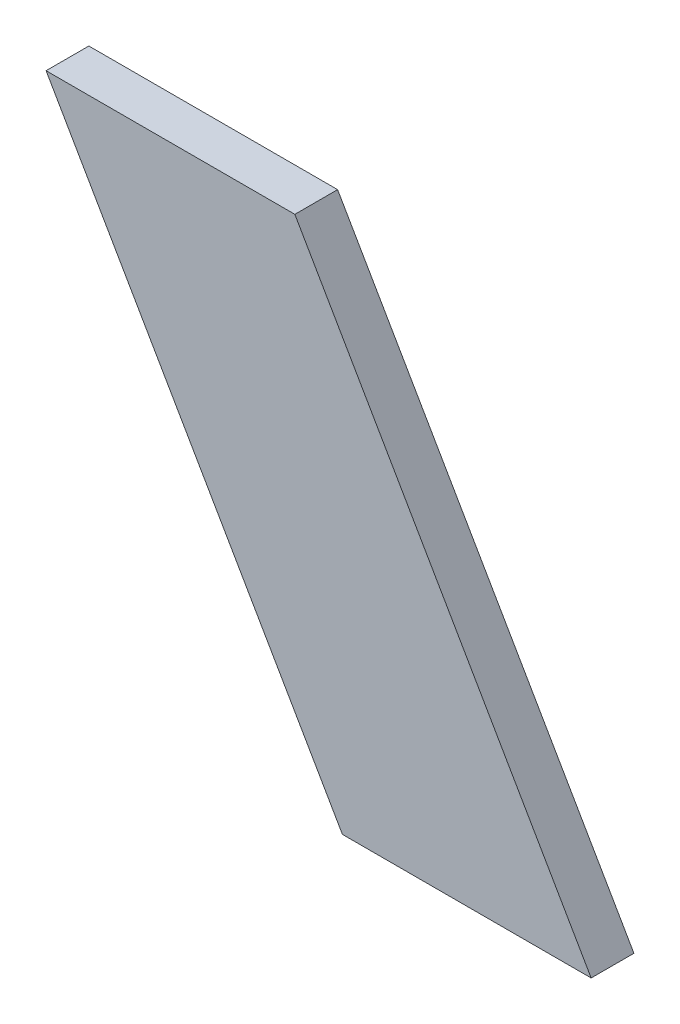
ISO-10303-21;
HEADER;
FILE_DESCRIPTION(('STEP AP214'),'2;1');
FILE_NAME('part.step','',(''),(''),'','','');
FILE_SCHEMA(('AUTOMOTIVE_DESIGN { 1 0 10303 214 1 1 1 1 }'));
ENDSEC;
DATA;
#1=APPLICATION_CONTEXT('core data for automotive mechanical design processes');
#2=APPLICATION_PROTOCOL_DEFINITION('international standard','automotive_design',2000,#1);
#3=PRODUCT_CONTEXT('',#1,'mechanical');
#4=PRODUCT('Part','Part','',(#3));
#5=PRODUCT_RELATED_PRODUCT_CATEGORY('part','',(#4));
#6=PRODUCT_DEFINITION_FORMATION('','',#4);
#7=PRODUCT_DEFINITION_CONTEXT('part definition',#1,'design');
#8=PRODUCT_DEFINITION('design','',#6,#7);
#9=PRODUCT_DEFINITION_SHAPE('','',#8);
#10=(LENGTH_UNIT() NAMED_UNIT(*) SI_UNIT(.MILLI.,.METRE.));
#11=(NAMED_UNIT(*) PLANE_ANGLE_UNIT() SI_UNIT($,.RADIAN.));
#12=(NAMED_UNIT(*) SI_UNIT($,.STERADIAN.) SOLID_ANGLE_UNIT());
#13=UNCERTAINTY_MEASURE_WITH_UNIT(LENGTH_MEASURE(1.E-05),#10,'distance_accuracy_value','');
#14=(GEOMETRIC_REPRESENTATION_CONTEXT(3) GLOBAL_UNCERTAINTY_ASSIGNED_CONTEXT((#13)) GLOBAL_UNIT_ASSIGNED_CONTEXT((#10,
#11,#12)) REPRESENTATION_CONTEXT('',''));
#15=CARTESIAN_POINT('',(0.,0.,0.));
#16=DIRECTION('',(0.,0.,1.));
#17=DIRECTION('',(1.,0.,0.));
#18=AXIS2_PLACEMENT_3D('',#15,#16,#17);
#19=CARTESIAN_POINT('',(64.4692193816531,-72.,-3.));
#20=DIRECTION('',(-0.866025403784439,-0.5,0.));
#21=DIRECTION('',(0.5,-0.866025403784439,0.));
#22=AXIS2_PLACEMENT_3D('',#19,#20,#21);
#23=PLANE('',#22);
#24=DIRECTION('',(0.,0.,1.));
#25=VECTOR('',#24,1.);
#26=CARTESIAN_POINT('',(64.4692193816531,-72.,-3.));
#27=LINE('',#26,#25);
#28=CARTESIAN_POINT('',(64.4692193816531,-72.,-3.));
#29=VERTEX_POINT('',#28);
#30=CARTESIAN_POINT('',(64.4692193816531,-72.,3.));
#31=VERTEX_POINT('',#30);
#32=EDGE_CURVE('E45',#29,#31,#27,.T.);
#33=ORIENTED_EDGE('',*,*,#32,.T.);
#34=DIRECTION('',(0.5,-0.866025403784439,0.));
#35=VECTOR('',#34,1.);
#36=CARTESIAN_POINT('',(64.4692193816531,-72.,3.));
#37=LINE('',#36,#35);
#38=CARTESIAN_POINT('',(22.9,0.,3.));
#39=VERTEX_POINT('',#38);
#40=EDGE_CURVE('E80',#39,#31,#37,.T.);
#41=ORIENTED_EDGE('',*,*,#40,.F.);
#42=DIRECTION('',(0.,0.,1.));
#43=VECTOR('',#42,1.);
#44=CARTESIAN_POINT('',(22.9,0.,-3.));
#45=LINE('',#44,#43);
#46=CARTESIAN_POINT('',(22.9,0.,-3.));
#47=VERTEX_POINT('',#46);
#48=EDGE_CURVE('E11',#47,#39,#45,.T.);
#49=ORIENTED_EDGE('',*,*,#48,.F.);
#50=DIRECTION('',(0.5,-0.866025403784439,0.));
#51=VECTOR('',#50,1.);
#52=CARTESIAN_POINT('',(64.4692193816531,-72.,-3.));
#53=LINE('',#52,#51);
#54=EDGE_CURVE('E79',#47,#29,#53,.T.);
#55=ORIENTED_EDGE('',*,*,#54,.T.);
#56=EDGE_LOOP('',(#33,#41,#49,#55));
#57=FACE_BOUND('',#56,.T.);
#58=ADVANCED_FACE('F39',(#57),#23,.T.);
#59=CARTESIAN_POINT('',(22.9,0.,-3.));
#60=DIRECTION('',(0.,1.,0.));
#61=DIRECTION('',(0.,0.,1.));
#62=AXIS2_PLACEMENT_3D('',#59,#60,#61);
#63=PLANE('',#62);
#64=ORIENTED_EDGE('',*,*,#48,.T.);
#65=DIRECTION('',(-1.,0.,0.));
#66=VECTOR('',#65,1.);
#67=CARTESIAN_POINT('',(22.9,0.,3.));
#68=LINE('',#67,#66);
#69=CARTESIAN_POINT('',(57.8,0.,3.));
#70=VERTEX_POINT('',#69);
#71=EDGE_CURVE('E96',#70,#39,#68,.T.);
#72=ORIENTED_EDGE('',*,*,#71,.F.);
#73=DIRECTION('',(0.,0.,1.));
#74=VECTOR('',#73,1.);
#75=CARTESIAN_POINT('',(57.8,0.,-3.));
#76=LINE('',#75,#74);
#77=CARTESIAN_POINT('',(57.8,0.,-3.));
#78=VERTEX_POINT('',#77);
#79=EDGE_CURVE('E50',#78,#70,#76,.T.);
#80=ORIENTED_EDGE('',*,*,#79,.F.);
#81=DIRECTION('',(-1.,0.,0.));
#82=VECTOR('',#81,1.);
#83=CARTESIAN_POINT('',(22.9,0.,-3.));
#84=LINE('',#83,#82);
#85=EDGE_CURVE('E82',#78,#47,#84,.T.);
#86=ORIENTED_EDGE('',*,*,#85,.T.);
#87=EDGE_LOOP('',(#64,#72,#80,#86));
#88=FACE_BOUND('',#87,.T.);
#89=ADVANCED_FACE('F112',(#88),#63,.T.);
#90=CARTESIAN_POINT('',(57.8,0.,-3.));
#91=DIRECTION('',(0.866025403784439,0.5,0.));
#92=DIRECTION('',(-0.5,0.866025403784439,0.));
#93=AXIS2_PLACEMENT_3D('',#90,#91,#92);
#94=PLANE('',#93);
#95=ORIENTED_EDGE('',*,*,#79,.T.);
#96=DIRECTION('',(-0.5,0.866025403784439,0.));
#97=VECTOR('',#96,1.);
#98=CARTESIAN_POINT('',(57.8,0.,3.));
#99=LINE('',#98,#97);
#100=CARTESIAN_POINT('',(99.3692193816531,-72.,3.));
#101=VERTEX_POINT('',#100);
#102=EDGE_CURVE('E95',#101,#70,#99,.T.);
#103=ORIENTED_EDGE('',*,*,#102,.F.);
#104=DIRECTION('',(0.,0.,1.));
#105=VECTOR('',#104,1.);
#106=CARTESIAN_POINT('',(99.3692193816531,-72.,-3.));
#107=LINE('',#106,#105);
#108=CARTESIAN_POINT('',(99.3692193816531,-72.,-3.));
#109=VERTEX_POINT('',#108);
#110=EDGE_CURVE('E84',#109,#101,#107,.T.);
#111=ORIENTED_EDGE('',*,*,#110,.F.);
#112=DIRECTION('',(-0.5,0.866025403784439,0.));
#113=VECTOR('',#112,1.);
#114=CARTESIAN_POINT('',(57.8,0.,-3.));
#115=LINE('',#114,#113);
#116=EDGE_CURVE('E101',#109,#78,#115,.T.);
#117=ORIENTED_EDGE('',*,*,#116,.T.);
#118=EDGE_LOOP('',(#95,#103,#111,#117));
#119=FACE_BOUND('',#118,.T.);
#120=ADVANCED_FACE('F110',(#119),#94,.T.);
#121=CARTESIAN_POINT('',(99.3692193816531,-72.,-3.));
#122=DIRECTION('',(0.,-1.,0.));
#123=DIRECTION('',(0.,0.,-1.));
#124=AXIS2_PLACEMENT_3D('',#121,#122,#123);
#125=PLANE('',#124);
#126=ORIENTED_EDGE('',*,*,#110,.T.);
#127=DIRECTION('',(1.,0.,0.));
#128=VECTOR('',#127,1.);
#129=CARTESIAN_POINT('',(99.3692193816531,-72.,3.));
#130=LINE('',#129,#128);
#131=EDGE_CURVE('E90',#31,#101,#130,.T.);
#132=ORIENTED_EDGE('',*,*,#131,.F.);
#133=ORIENTED_EDGE('',*,*,#32,.F.);
#134=DIRECTION('',(1.,0.,0.));
#135=VECTOR('',#134,1.);
#136=CARTESIAN_POINT('',(99.3692193816531,-72.,-3.));
#137=LINE('',#136,#135);
#138=EDGE_CURVE('E105',#29,#109,#137,.T.);
#139=ORIENTED_EDGE('',*,*,#138,.T.);
#140=EDGE_LOOP('',(#126,#132,#133,#139));
#141=FACE_BOUND('',#140,.T.);
#142=ADVANCED_FACE('F88',(#141),#125,.T.);
#143=CARTESIAN_POINT('',(0.,0.,-3.));
#144=DIRECTION('',(0.,0.,-1.));
#145=DIRECTION('',(-1.,0.,0.));
#146=AXIS2_PLACEMENT_3D('',#143,#144,#145);
#147=PLANE('',#146);
#148=ORIENTED_EDGE('',*,*,#54,.F.);
#149=ORIENTED_EDGE('',*,*,#85,.F.);
#150=ORIENTED_EDGE('',*,*,#116,.F.);
#151=ORIENTED_EDGE('',*,*,#138,.F.);
#152=EDGE_LOOP('',(#148,#149,#150,#151));
#153=FACE_BOUND('',#152,.T.);
#154=ADVANCED_FACE('F111',(#153),#147,.T.);
#155=CARTESIAN_POINT('',(0.,0.,3.));
#156=DIRECTION('',(0.,0.,-1.));
#157=DIRECTION('',(-1.,0.,0.));
#158=AXIS2_PLACEMENT_3D('',#155,#156,#157);
#159=PLANE('',#158);
#160=ORIENTED_EDGE('',*,*,#40,.T.);
#161=ORIENTED_EDGE('',*,*,#131,.T.);
#162=ORIENTED_EDGE('',*,*,#102,.T.);
#163=ORIENTED_EDGE('',*,*,#71,.T.);
#164=EDGE_LOOP('',(#160,#161,#162,#163));
#165=FACE_BOUND('',#164,.T.);
#166=ADVANCED_FACE('F94',(#165),#159,.F.);
#167=CLOSED_SHELL('',(#58,#89,#120,#142,#154,#166));
#168=MANIFOLD_SOLID_BREP('B2',#167);
#169=ADVANCED_BREP_SHAPE_REPRESENTATION('',(#18,#168),#14);
#170=SHAPE_DEFINITION_REPRESENTATION(#9,#169);
ENDSEC;
END-ISO-10303-21;
